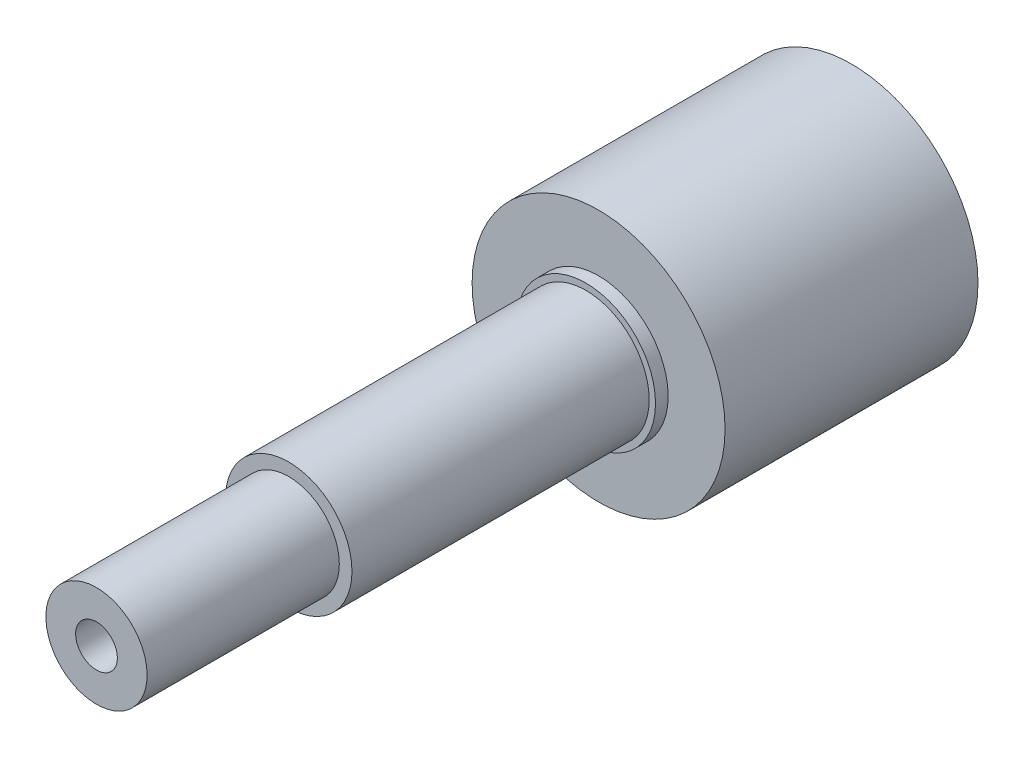
ISO-10303-21;
HEADER;
FILE_DESCRIPTION(('STEP AP214'),'2;1');
FILE_NAME('part.step','',(''),(''),'','','');
FILE_SCHEMA(('AUTOMOTIVE_DESIGN { 1 0 10303 214 1 1 1 1 }'));
ENDSEC;
DATA;
#1=APPLICATION_CONTEXT('core data for automotive mechanical design processes');
#2=APPLICATION_PROTOCOL_DEFINITION('international standard','automotive_design',2000,#1);
#3=PRODUCT_CONTEXT('',#1,'mechanical');
#4=PRODUCT('Part','Part','',(#3));
#5=PRODUCT_RELATED_PRODUCT_CATEGORY('part','',(#4));
#6=PRODUCT_DEFINITION_FORMATION('','',#4);
#7=PRODUCT_DEFINITION_CONTEXT('part definition',#1,'design');
#8=PRODUCT_DEFINITION('design','',#6,#7);
#9=PRODUCT_DEFINITION_SHAPE('','',#8);
#10=(LENGTH_UNIT() NAMED_UNIT(*) SI_UNIT(.MILLI.,.METRE.));
#11=(NAMED_UNIT(*) PLANE_ANGLE_UNIT() SI_UNIT($,.RADIAN.));
#12=(NAMED_UNIT(*) SI_UNIT($,.STERADIAN.) SOLID_ANGLE_UNIT());
#13=UNCERTAINTY_MEASURE_WITH_UNIT(LENGTH_MEASURE(1.E-05),#10,'distance_accuracy_value','');
#14=(GEOMETRIC_REPRESENTATION_CONTEXT(3) GLOBAL_UNCERTAINTY_ASSIGNED_CONTEXT((#13)) GLOBAL_UNIT_ASSIGNED_CONTEXT((#10,
#11,#12)) REPRESENTATION_CONTEXT('',''));
#15=CARTESIAN_POINT('',(0.,0.,0.));
#16=DIRECTION('',(0.,0.,1.));
#17=DIRECTION('',(1.,0.,0.));
#18=AXIS2_PLACEMENT_3D('',#15,#16,#17);
#19=CARTESIAN_POINT('',(0.,0.,44.5));
#20=DIRECTION('',(0.,0.,1.));
#21=DIRECTION('',(1.,0.,0.));
#22=AXIS2_PLACEMENT_3D('',#19,#20,#21);
#23=CYLINDRICAL_SURFACE('',#22,4.);
#24=CARTESIAN_POINT('',(0.,0.,44.5));
#25=DIRECTION('',(0.,0.,1.));
#26=DIRECTION('',(1.,0.,0.));
#27=AXIS2_PLACEMENT_3D('',#24,#25,#26);
#28=CIRCLE('',#27,4.);
#29=CARTESIAN_POINT('',(4.,0.,44.5));
#30=VERTEX_POINT('',#29);
#31=EDGE_CURVE('E64',#30,#30,#28,.T.);
#32=ORIENTED_EDGE('',*,*,#31,.T.);
#33=EDGE_LOOP('',(#32));
#34=FACE_BOUND('',#33,.T.);
#35=CARTESIAN_POINT('',(0.,0.,59.7));
#36=DIRECTION('',(0.,0.,1.));
#37=DIRECTION('',(1.,0.,0.));
#38=AXIS2_PLACEMENT_3D('',#35,#36,#37);
#39=CIRCLE('',#38,4.);
#40=CARTESIAN_POINT('',(4.,0.,59.7));
#41=VERTEX_POINT('',#40);
#42=EDGE_CURVE('E266',#41,#41,#39,.T.);
#43=ORIENTED_EDGE('',*,*,#42,.F.);
#44=EDGE_LOOP('',(#43));
#45=FACE_BOUND('',#44,.T.);
#46=ADVANCED_FACE('F40',(#34,#45),#23,.T.);
#47=CARTESIAN_POINT('',(0.,0.,25.));
#48=DIRECTION('',(0.,0.,-1.));
#49=DIRECTION('',(-1.,0.,0.));
#50=AXIS2_PLACEMENT_3D('',#47,#48,#49);
#51=CYLINDRICAL_SURFACE('',#50,5.);
#52=CARTESIAN_POINT('',(0.,0.,21.));
#53=DIRECTION('',(0.,0.,1.));
#54=DIRECTION('',(1.,0.,0.));
#55=AXIS2_PLACEMENT_3D('',#52,#53,#54);
#56=CIRCLE('',#55,5.);
#57=CARTESIAN_POINT('',(5.,0.,21.));
#58=VERTEX_POINT('',#57);
#59=EDGE_CURVE('E86',#58,#58,#56,.T.);
#60=ORIENTED_EDGE('',*,*,#59,.T.);
#61=EDGE_LOOP('',(#60));
#62=FACE_BOUND('',#61,.T.);
#63=CARTESIAN_POINT('',(0.,0.,44.5));
#64=DIRECTION('',(0.,0.,1.));
#65=DIRECTION('',(1.,0.,0.));
#66=AXIS2_PLACEMENT_3D('',#63,#64,#65);
#67=CIRCLE('',#66,5.);
#68=CARTESIAN_POINT('',(5.,0.,44.5));
#69=VERTEX_POINT('',#68);
#70=EDGE_CURVE('E60',#69,#69,#67,.T.);
#71=ORIENTED_EDGE('',*,*,#70,.F.);
#72=EDGE_LOOP('',(#71));
#73=FACE_BOUND('',#72,.T.);
#74=ADVANCED_FACE('F108',(#62,#73),#51,.T.);
#75=CARTESIAN_POINT('',(0.,0.,20.));
#76=DIRECTION('',(0.,0.,1.));
#77=DIRECTION('',(1.,0.,0.));
#78=AXIS2_PLACEMENT_3D('',#75,#76,#77);
#79=PLANE('',#78);
#80=CARTESIAN_POINT('',(0.,0.,20.));
#81=DIRECTION('',(0.,0.,1.));
#82=DIRECTION('',(1.,0.,0.));
#83=AXIS2_PLACEMENT_3D('',#80,#81,#82);
#84=CIRCLE('',#83,10.);
#85=CARTESIAN_POINT('',(10.,0.,20.));
#86=VERTEX_POINT('',#85);
#87=EDGE_CURVE('E11',#86,#86,#84,.T.);
#88=ORIENTED_EDGE('',*,*,#87,.T.);
#89=EDGE_LOOP('',(#88));
#90=FACE_BOUND('',#89,.T.);
#91=CARTESIAN_POINT('',(0.,0.,20.));
#92=DIRECTION('',(0.,0.,1.));
#93=DIRECTION('',(1.,0.,0.));
#94=AXIS2_PLACEMENT_3D('',#91,#92,#93);
#95=CIRCLE('',#94,5.5);
#96=CARTESIAN_POINT('',(5.5,0.,20.));
#97=VERTEX_POINT('',#96);
#98=EDGE_CURVE('E58',#97,#97,#95,.T.);
#99=ORIENTED_EDGE('',*,*,#98,.F.);
#100=EDGE_LOOP('',(#99));
#101=FACE_BOUND('',#100,.T.);
#102=ADVANCED_FACE('F106',(#90,#101),#79,.T.);
#103=CARTESIAN_POINT('',(0.,0.,20.));
#104=DIRECTION('',(0.,0.,-1.));
#105=DIRECTION('',(-1.,0.,0.));
#106=AXIS2_PLACEMENT_3D('',#103,#104,#105);
#107=CYLINDRICAL_SURFACE('',#106,10.);
#108=ORIENTED_EDGE('',*,*,#87,.F.);
#109=EDGE_LOOP('',(#108));
#110=FACE_BOUND('',#109,.T.);
#111=CARTESIAN_POINT('',(0.,0.,0.));
#112=DIRECTION('',(0.,0.,1.));
#113=DIRECTION('',(1.,0.,0.));
#114=AXIS2_PLACEMENT_3D('',#111,#112,#113);
#115=CIRCLE('',#114,10.);
#116=CARTESIAN_POINT('',(10.,0.,0.));
#117=VERTEX_POINT('',#116);
#118=EDGE_CURVE('E49',#117,#117,#115,.T.);
#119=ORIENTED_EDGE('',*,*,#118,.T.);
#120=EDGE_LOOP('',(#119));
#121=FACE_BOUND('',#120,.T.);
#122=ADVANCED_FACE('F42',(#110,#121),#107,.T.);
#123=CARTESIAN_POINT('',(0.,0.,0.));
#124=DIRECTION('',(0.,0.,1.));
#125=DIRECTION('',(1.,0.,0.));
#126=AXIS2_PLACEMENT_3D('',#123,#124,#125);
#127=PLANE('',#126);
#128=CARTESIAN_POINT('',(0.,6.,0.));
#129=DIRECTION('',(0.,0.,-1.));
#130=DIRECTION('',(-1.,0.,0.));
#131=AXIS2_PLACEMENT_3D('',#128,#129,#130);
#132=CIRCLE('',#131,1.65);
#133=CARTESIAN_POINT('',(-1.65,6.,0.));
#134=VERTEX_POINT('',#133);
#135=EDGE_CURVE('E87',#134,#134,#132,.T.);
#136=ORIENTED_EDGE('',*,*,#135,.F.);
#137=EDGE_LOOP('',(#136));
#138=FACE_BOUND('',#137,.T.);
#139=CARTESIAN_POINT('',(0.,-6.,0.));
#140=DIRECTION('',(0.,0.,-1.));
#141=DIRECTION('',(1.,0.,0.));
#142=AXIS2_PLACEMENT_3D('',#139,#140,#141);
#143=CIRCLE('',#142,1.65);
#144=CARTESIAN_POINT('',(1.65,-6.,0.));
#145=VERTEX_POINT('',#144);
#146=EDGE_CURVE('E63',#145,#145,#143,.T.);
#147=ORIENTED_EDGE('',*,*,#146,.F.);
#148=EDGE_LOOP('',(#147));
#149=FACE_BOUND('',#148,.T.);
#150=ORIENTED_EDGE('',*,*,#118,.F.);
#151=EDGE_LOOP('',(#150));
#152=FACE_BOUND('',#151,.T.);
#153=ADVANCED_FACE('F114',(#138,#149,#152),#127,.F.);
#154=CARTESIAN_POINT('',(0.,0.,21.));
#155=DIRECTION('',(0.,0.,1.));
#156=DIRECTION('',(1.,0.,0.));
#157=AXIS2_PLACEMENT_3D('',#154,#155,#156);
#158=PLANE('',#157);
#159=CARTESIAN_POINT('',(0.,0.,21.));
#160=DIRECTION('',(0.,0.,1.));
#161=DIRECTION('',(1.,0.,0.));
#162=AXIS2_PLACEMENT_3D('',#159,#160,#161);
#163=CIRCLE('',#162,5.5);
#164=CARTESIAN_POINT('',(5.5,0.,21.));
#165=VERTEX_POINT('',#164);
#166=EDGE_CURVE('E55',#165,#165,#163,.T.);
#167=ORIENTED_EDGE('',*,*,#166,.T.);
#168=EDGE_LOOP('',(#167));
#169=FACE_BOUND('',#168,.T.);
#170=ORIENTED_EDGE('',*,*,#59,.F.);
#171=EDGE_LOOP('',(#170));
#172=FACE_BOUND('',#171,.T.);
#173=ADVANCED_FACE('F148',(#169,#172),#158,.T.);
#174=CARTESIAN_POINT('',(0.,0.,21.));
#175=DIRECTION('',(0.,0.,-1.));
#176=DIRECTION('',(-1.,0.,0.));
#177=AXIS2_PLACEMENT_3D('',#174,#175,#176);
#178=CYLINDRICAL_SURFACE('',#177,5.5);
#179=ORIENTED_EDGE('',*,*,#166,.F.);
#180=EDGE_LOOP('',(#179));
#181=FACE_BOUND('',#180,.T.);
#182=ORIENTED_EDGE('',*,*,#98,.T.);
#183=EDGE_LOOP('',(#182));
#184=FACE_BOUND('',#183,.T.);
#185=ADVANCED_FACE('F104',(#181,#184),#178,.T.);
#186=CARTESIAN_POINT('',(0.,-6.,10.));
#187=DIRECTION('',(0.,0.,-1.));
#188=DIRECTION('',(-1.,0.,0.));
#189=AXIS2_PLACEMENT_3D('',#186,#187,#188);
#190=CYLINDRICAL_SURFACE('',#189,1.65);
#191=CARTESIAN_POINT('',(0.,-6.,10.));
#192=DIRECTION('',(0.,0.,-1.));
#193=DIRECTION('',(1.,0.,0.));
#194=AXIS2_PLACEMENT_3D('',#191,#192,#193);
#195=CIRCLE('',#194,1.65);
#196=CARTESIAN_POINT('',(1.65,-6.,10.));
#197=VERTEX_POINT('',#196);
#198=EDGE_CURVE('E70',#197,#197,#195,.T.);
#199=ORIENTED_EDGE('',*,*,#198,.F.);
#200=EDGE_LOOP('',(#199));
#201=FACE_BOUND('',#200,.T.);
#202=ORIENTED_EDGE('',*,*,#146,.T.);
#203=EDGE_LOOP('',(#202));
#204=FACE_BOUND('',#203,.T.);
#205=ADVANCED_FACE('F143',(#201,#204),#190,.F.);
#206=CARTESIAN_POINT('',(0.,-6.,10.));
#207=DIRECTION('',(0.,0.,1.));
#208=DIRECTION('',(1.,0.,0.));
#209=AXIS2_PLACEMENT_3D('',#206,#207,#208);
#210=PLANE('',#209);
#211=ORIENTED_EDGE('',*,*,#198,.T.);
#212=EDGE_LOOP('',(#211));
#213=FACE_BOUND('',#212,.T.);
#214=ADVANCED_FACE('F139',(#213),#210,.F.);
#215=CARTESIAN_POINT('',(0.,6.,10.));
#216=DIRECTION('',(0.,0.,-1.));
#217=DIRECTION('',(-1.,0.,0.));
#218=AXIS2_PLACEMENT_3D('',#215,#216,#217);
#219=CYLINDRICAL_SURFACE('',#218,1.65);
#220=CARTESIAN_POINT('',(0.,6.,10.));
#221=DIRECTION('',(0.,0.,-1.));
#222=DIRECTION('',(-1.,0.,0.));
#223=AXIS2_PLACEMENT_3D('',#220,#221,#222);
#224=CIRCLE('',#223,1.65);
#225=CARTESIAN_POINT('',(-1.65,6.,10.));
#226=VERTEX_POINT('',#225);
#227=EDGE_CURVE('E82',#226,#226,#224,.T.);
#228=ORIENTED_EDGE('',*,*,#227,.F.);
#229=EDGE_LOOP('',(#228));
#230=FACE_BOUND('',#229,.T.);
#231=ORIENTED_EDGE('',*,*,#135,.T.);
#232=EDGE_LOOP('',(#231));
#233=FACE_BOUND('',#232,.T.);
#234=ADVANCED_FACE('F135',(#230,#233),#219,.F.);
#235=CARTESIAN_POINT('',(0.,6.,10.));
#236=DIRECTION('',(0.,0.,-1.));
#237=DIRECTION('',(-1.,0.,0.));
#238=AXIS2_PLACEMENT_3D('',#235,#236,#237);
#239=PLANE('',#238);
#240=ORIENTED_EDGE('',*,*,#227,.T.);
#241=EDGE_LOOP('',(#240));
#242=FACE_BOUND('',#241,.T.);
#243=ADVANCED_FACE('F131',(#242),#239,.T.);
#244=CARTESIAN_POINT('',(0.,0.,44.5));
#245=DIRECTION('',(0.,0.,1.));
#246=DIRECTION('',(1.,0.,0.));
#247=AXIS2_PLACEMENT_3D('',#244,#245,#246);
#248=PLANE('',#247);
#249=ORIENTED_EDGE('',*,*,#31,.F.);
#250=EDGE_LOOP('',(#249));
#251=FACE_BOUND('',#250,.T.);
#252=ORIENTED_EDGE('',*,*,#70,.T.);
#253=EDGE_LOOP('',(#252));
#254=FACE_BOUND('',#253,.T.);
#255=ADVANCED_FACE('F127',(#251,#254),#248,.T.);
#256=CARTESIAN_POINT('',(0.,0.,59.7));
#257=DIRECTION('',(0.,0.,1.));
#258=DIRECTION('',(1.,0.,0.));
#259=AXIS2_PLACEMENT_3D('',#256,#257,#258);
#260=PLANE('',#259);
#261=ORIENTED_EDGE('',*,*,#42,.T.);
#262=EDGE_LOOP('',(#261));
#263=FACE_BOUND('',#262,.T.);
#264=CARTESIAN_POINT('',(0.,0.,59.7));
#265=DIRECTION('',(0.,0.,1.));
#266=DIRECTION('',(1.,0.,0.));
#267=AXIS2_PLACEMENT_3D('',#264,#265,#266);
#268=CIRCLE('',#267,1.65);
#269=CARTESIAN_POINT('',(1.65,0.,59.7));
#270=VERTEX_POINT('',#269);
#271=EDGE_CURVE('E44',#270,#270,#268,.F.);
#272=ORIENTED_EDGE('',*,*,#271,.T.);
#273=EDGE_LOOP('',(#272));
#274=FACE_BOUND('',#273,.T.);
#275=ADVANCED_FACE('F130',(#263,#274),#260,.T.);
#276=CARTESIAN_POINT('',(0.,0.,50.5));
#277=DIRECTION('',(0.,0.,1.));
#278=DIRECTION('',(1.,0.,0.));
#279=AXIS2_PLACEMENT_3D('',#276,#277,#278);
#280=PLANE('',#279);
#281=CARTESIAN_POINT('',(0.,0.,50.5));
#282=DIRECTION('',(0.,0.,1.));
#283=DIRECTION('',(1.,0.,0.));
#284=AXIS2_PLACEMENT_3D('',#281,#282,#283);
#285=CIRCLE('',#284,1.65);
#286=CARTESIAN_POINT('',(1.65,0.,50.5));
#287=VERTEX_POINT('',#286);
#288=EDGE_CURVE('E73',#287,#287,#285,.T.);
#289=ORIENTED_EDGE('',*,*,#288,.T.);
#290=EDGE_LOOP('',(#289));
#291=FACE_BOUND('',#290,.T.);
#292=ADVANCED_FACE('F187',(#291),#280,.T.);
#293=CARTESIAN_POINT('',(0.,0.,50.5));
#294=DIRECTION('',(0.,0.,1.));
#295=DIRECTION('',(1.,0.,0.));
#296=AXIS2_PLACEMENT_3D('',#293,#294,#295);
#297=CYLINDRICAL_SURFACE('',#296,1.65);
#298=ORIENTED_EDGE('',*,*,#288,.F.);
#299=EDGE_LOOP('',(#298));
#300=FACE_BOUND('',#299,.T.);
#301=ORIENTED_EDGE('',*,*,#271,.F.);
#302=EDGE_LOOP('',(#301));
#303=FACE_BOUND('',#302,.T.);
#304=ADVANCED_FACE('F125',(#300,#303),#297,.F.);
#305=CLOSED_SHELL('',(#46,#74,#102,#122,#153,#173,#185,#205,#214,#234,#243,#255,#275,#292,#304));
#306=MANIFOLD_SOLID_BREP('B2',#305);
#307=ADVANCED_BREP_SHAPE_REPRESENTATION('',(#18,#306),#14);
#308=SHAPE_DEFINITION_REPRESENTATION(#9,#307);
ENDSEC;
END-ISO-10303-21;
